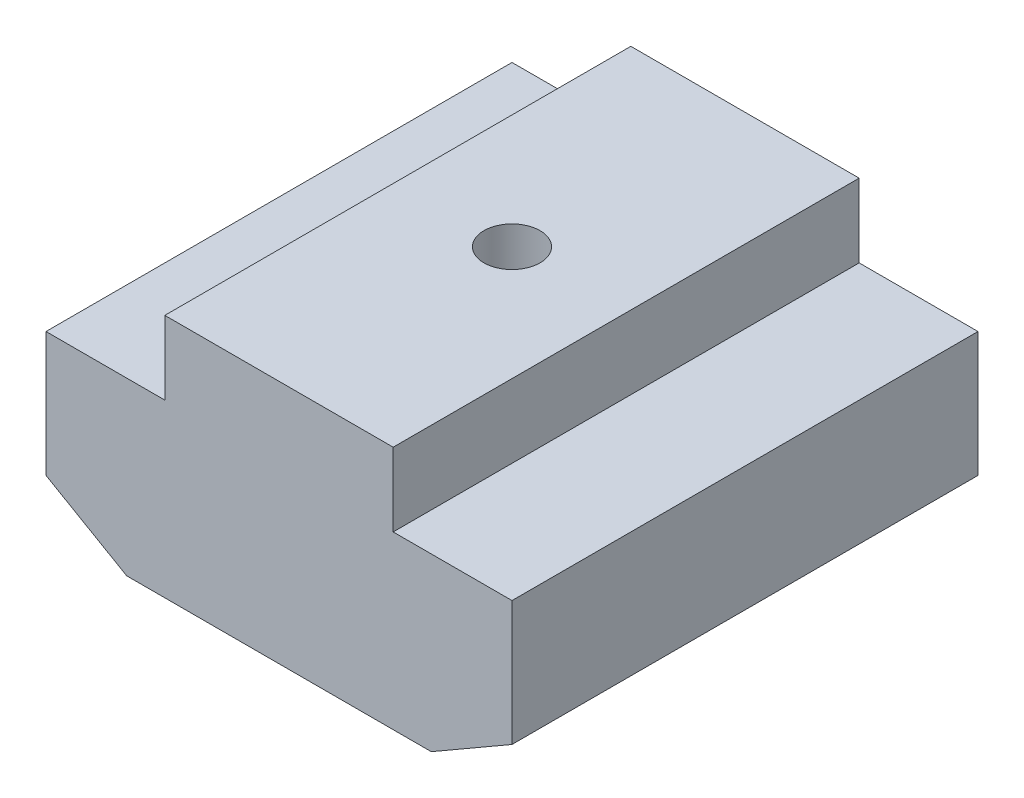
ISO-10303-21;
HEADER;
FILE_DESCRIPTION(('STEP AP214'),'2;1');
FILE_NAME('part.step','',(''),(''),'','','');
FILE_SCHEMA(('AUTOMOTIVE_DESIGN { 1 0 10303 214 1 1 1 1 }'));
ENDSEC;
DATA;
#1=APPLICATION_CONTEXT('core data for automotive mechanical design processes');
#2=APPLICATION_PROTOCOL_DEFINITION('international standard','automotive_design',2000,#1);
#3=PRODUCT_CONTEXT('',#1,'mechanical');
#4=PRODUCT('Part','Part','',(#3));
#5=PRODUCT_RELATED_PRODUCT_CATEGORY('part','',(#4));
#6=PRODUCT_DEFINITION_FORMATION('','',#4);
#7=PRODUCT_DEFINITION_CONTEXT('part definition',#1,'design');
#8=PRODUCT_DEFINITION('design','',#6,#7);
#9=PRODUCT_DEFINITION_SHAPE('','',#8);
#10=(LENGTH_UNIT() NAMED_UNIT(*) SI_UNIT(.MILLI.,.METRE.));
#11=(NAMED_UNIT(*) PLANE_ANGLE_UNIT() SI_UNIT($,.RADIAN.));
#12=(NAMED_UNIT(*) SI_UNIT($,.STERADIAN.) SOLID_ANGLE_UNIT());
#13=UNCERTAINTY_MEASURE_WITH_UNIT(LENGTH_MEASURE(1.E-05),#10,'distance_accuracy_value','');
#14=(GEOMETRIC_REPRESENTATION_CONTEXT(3) GLOBAL_UNCERTAINTY_ASSIGNED_CONTEXT((#13)) GLOBAL_UNIT_ASSIGNED_CONTEXT((#10,
#11,#12)) REPRESENTATION_CONTEXT('',''));
#15=CARTESIAN_POINT('',(0.,0.,0.));
#16=DIRECTION('',(0.,0.,1.));
#17=DIRECTION('',(1.,0.,0.));
#18=AXIS2_PLACEMENT_3D('',#15,#16,#17);
#19=CARTESIAN_POINT('',(-10.,-1.675,0.));
#20=DIRECTION('',(0.50000000000019,0.866025403784329,0.));
#21=DIRECTION('',(0.,0.,-1.));
#22=AXIS2_PLACEMENT_3D('',#19,#20,#21);
#23=PLANE('',#22);
#24=DIRECTION('',(0.,0.,1.));
#25=VECTOR('',#24,1.);
#26=CARTESIAN_POINT('',(-10.,-1.675,0.));
#27=LINE('',#26,#25);
#28=CARTESIAN_POINT('',(-10.,-1.675,-10.));
#29=VERTEX_POINT('',#28);
#30=CARTESIAN_POINT('',(-10.,-1.675,10.));
#31=VERTEX_POINT('',#30);
#32=EDGE_CURVE('E274',#29,#31,#27,.T.);
#33=ORIENTED_EDGE('',*,*,#32,.F.);
#34=DIRECTION('',(0.866025403784329,-0.50000000000019,0.));
#35=VECTOR('',#34,1.);
#36=CARTESIAN_POINT('',(-8.26794919243,-2.675,-10.));
#37=LINE('',#36,#35);
#38=CARTESIAN_POINT('',(-6.53589838486,-3.675,-10.));
#39=VERTEX_POINT('',#38);
#40=EDGE_CURVE('E185',#29,#39,#37,.T.);
#41=ORIENTED_EDGE('',*,*,#40,.T.);
#42=DIRECTION('',(0.,0.,1.));
#43=VECTOR('',#42,1.);
#44=CARTESIAN_POINT('',(-6.53589838486,-3.675,0.));
#45=LINE('',#44,#43);
#46=CARTESIAN_POINT('',(-6.53589838486,-3.675,10.));
#47=VERTEX_POINT('',#46);
#48=EDGE_CURVE('E11',#39,#47,#45,.T.);
#49=ORIENTED_EDGE('',*,*,#48,.T.);
#50=DIRECTION('',(-0.866025403784329,0.50000000000019,0.));
#51=VECTOR('',#50,1.);
#52=CARTESIAN_POINT('',(-8.26794919243,-2.675,10.));
#53=LINE('',#52,#51);
#54=EDGE_CURVE('E25',#47,#31,#53,.T.);
#55=ORIENTED_EDGE('',*,*,#54,.T.);
#56=EDGE_LOOP('',(#33,#41,#49,#55));
#57=FACE_BOUND('',#56,.T.);
#58=ADVANCED_FACE('F17',(#57),#23,.F.);
#59=CARTESIAN_POINT('',(10.,-3.675,0.));
#60=DIRECTION('',(0.,1.,0.));
#61=DIRECTION('',(1.,0.,0.));
#62=AXIS2_PLACEMENT_3D('',#59,#60,#61);
#63=PLANE('',#62);
#64=CARTESIAN_POINT('',(0.,-3.675,0.));
#65=DIRECTION('',(0.,1.,0.));
#66=DIRECTION('',(1.,0.,0.));
#67=AXIS2_PLACEMENT_3D('',#64,#65,#66);
#68=CIRCLE('',#67,2.067);
#69=CARTESIAN_POINT('',(-2.067,-3.675,0.));
#70=VERTEX_POINT('',#69);
#71=CARTESIAN_POINT('',(2.067,-3.675,0.));
#72=VERTEX_POINT('',#71);
#73=EDGE_CURVE('E144',#70,#72,#68,.T.);
#74=ORIENTED_EDGE('',*,*,#73,.T.);
#75=CARTESIAN_POINT('',(0.,-3.675,0.));
#76=DIRECTION('',(0.,1.,0.));
#77=DIRECTION('',(1.,0.,0.));
#78=AXIS2_PLACEMENT_3D('',#75,#76,#77);
#79=CIRCLE('',#78,2.067);
#80=EDGE_CURVE('E140',#72,#70,#79,.T.);
#81=ORIENTED_EDGE('',*,*,#80,.T.);
#82=EDGE_LOOP('',(#74,#81));
#83=FACE_BOUND('',#82,.T.);
#84=ORIENTED_EDGE('',*,*,#48,.F.);
#85=DIRECTION('',(1.,0.,0.));
#86=VECTOR('',#85,1.);
#87=CARTESIAN_POINT('',(0.,-3.675,-10.));
#88=LINE('',#87,#86);
#89=CARTESIAN_POINT('',(6.53589838486,-3.675,-10.));
#90=VERTEX_POINT('',#89);
#91=EDGE_CURVE('E187',#39,#90,#88,.T.);
#92=ORIENTED_EDGE('',*,*,#91,.T.);
#93=DIRECTION('',(0.,0.,1.));
#94=VECTOR('',#93,1.);
#95=CARTESIAN_POINT('',(6.53589838486,-3.675,0.));
#96=LINE('',#95,#94);
#97=CARTESIAN_POINT('',(6.53589838486,-3.675,10.));
#98=VERTEX_POINT('',#97);
#99=EDGE_CURVE('E265',#90,#98,#96,.T.);
#100=ORIENTED_EDGE('',*,*,#99,.T.);
#101=DIRECTION('',(1.,0.,0.));
#102=VECTOR('',#101,1.);
#103=CARTESIAN_POINT('',(0.,-3.675,10.));
#104=LINE('',#103,#102);
#105=EDGE_CURVE('E259',#47,#98,#104,.T.);
#106=ORIENTED_EDGE('',*,*,#105,.F.);
#107=EDGE_LOOP('',(#84,#92,#100,#106));
#108=FACE_BOUND('',#107,.T.);
#109=ADVANCED_FACE('F142',(#83,#108),#63,.F.);
#110=CARTESIAN_POINT('',(0.,0.,10.));
#111=DIRECTION('',(0.,0.,1.));
#112=DIRECTION('',(1.,0.,0.));
#113=AXIS2_PLACEMENT_3D('',#110,#111,#112);
#114=PLANE('',#113);
#115=ORIENTED_EDGE('',*,*,#105,.T.);
#116=DIRECTION('',(-0.866025403784329,-0.50000000000019,0.));
#117=VECTOR('',#116,1.);
#118=CARTESIAN_POINT('',(8.26794919243,-2.675,10.));
#119=LINE('',#118,#117);
#120=CARTESIAN_POINT('',(10.,-1.675,10.));
#121=VERTEX_POINT('',#120);
#122=EDGE_CURVE('E277',#121,#98,#119,.T.);
#123=ORIENTED_EDGE('',*,*,#122,.F.);
#124=DIRECTION('',(0.,1.,0.));
#125=VECTOR('',#124,1.);
#126=CARTESIAN_POINT('',(10.,1.,10.));
#127=LINE('',#126,#125);
#128=CARTESIAN_POINT('',(10.,3.675,10.));
#129=VERTEX_POINT('',#128);
#130=EDGE_CURVE('E262',#121,#129,#127,.T.);
#131=ORIENTED_EDGE('',*,*,#130,.T.);
#132=DIRECTION('',(-1.,0.,0.));
#133=VECTOR('',#132,1.);
#134=CARTESIAN_POINT('',(7.45,3.675,10.));
#135=LINE('',#134,#133);
#136=CARTESIAN_POINT('',(4.9,3.675,10.));
#137=VERTEX_POINT('',#136);
#138=EDGE_CURVE('E215',#129,#137,#135,.T.);
#139=ORIENTED_EDGE('',*,*,#138,.T.);
#140=DIRECTION('',(0.,1.,0.));
#141=VECTOR('',#140,1.);
#142=CARTESIAN_POINT('',(4.9,5.25,10.));
#143=LINE('',#142,#141);
#144=CARTESIAN_POINT('',(4.9,6.825,10.));
#145=VERTEX_POINT('',#144);
#146=EDGE_CURVE('E251',#137,#145,#143,.T.);
#147=ORIENTED_EDGE('',*,*,#146,.T.);
#148=DIRECTION('',(-1.,0.,0.));
#149=VECTOR('',#148,1.);
#150=CARTESIAN_POINT('',(0.,6.825,10.));
#151=LINE('',#150,#149);
#152=CARTESIAN_POINT('',(-4.9,6.825,10.));
#153=VERTEX_POINT('',#152);
#154=EDGE_CURVE('E196',#145,#153,#151,.T.);
#155=ORIENTED_EDGE('',*,*,#154,.T.);
#156=DIRECTION('',(0.,-1.,0.));
#157=VECTOR('',#156,1.);
#158=CARTESIAN_POINT('',(-4.9,5.25,10.));
#159=LINE('',#158,#157);
#160=CARTESIAN_POINT('',(-4.9,3.675,10.));
#161=VERTEX_POINT('',#160);
#162=EDGE_CURVE('E240',#153,#161,#159,.T.);
#163=ORIENTED_EDGE('',*,*,#162,.T.);
#164=DIRECTION('',(-1.,0.,0.));
#165=VECTOR('',#164,1.);
#166=CARTESIAN_POINT('',(-7.45,3.675,10.));
#167=LINE('',#166,#165);
#168=CARTESIAN_POINT('',(-10.,3.675,10.));
#169=VERTEX_POINT('',#168);
#170=EDGE_CURVE('E229',#161,#169,#167,.T.);
#171=ORIENTED_EDGE('',*,*,#170,.T.);
#172=DIRECTION('',(0.,-1.,0.));
#173=VECTOR('',#172,1.);
#174=CARTESIAN_POINT('',(-10.,1.,10.));
#175=LINE('',#174,#173);
#176=EDGE_CURVE('E270',#169,#31,#175,.T.);
#177=ORIENTED_EDGE('',*,*,#176,.T.);
#178=ORIENTED_EDGE('',*,*,#54,.F.);
#179=EDGE_LOOP('',(#115,#123,#131,#139,#147,#155,#163,#171,#177,#178));
#180=FACE_BOUND('',#179,.T.);
#181=ADVANCED_FACE('F291',(#180),#114,.T.);
#182=CARTESIAN_POINT('',(0.,0.,-10.));
#183=DIRECTION('',(0.,0.,1.));
#184=DIRECTION('',(1.,0.,0.));
#185=AXIS2_PLACEMENT_3D('',#182,#183,#184);
#186=PLANE('',#185);
#187=ORIENTED_EDGE('',*,*,#40,.F.);
#188=DIRECTION('',(0.,-1.,0.));
#189=VECTOR('',#188,1.);
#190=CARTESIAN_POINT('',(-10.,1.,-10.));
#191=LINE('',#190,#189);
#192=CARTESIAN_POINT('',(-10.,3.675,-10.));
#193=VERTEX_POINT('',#192);
#194=EDGE_CURVE('E188',#193,#29,#191,.T.);
#195=ORIENTED_EDGE('',*,*,#194,.F.);
#196=DIRECTION('',(-1.,0.,0.));
#197=VECTOR('',#196,1.);
#198=CARTESIAN_POINT('',(-7.45,3.675,-10.));
#199=LINE('',#198,#197);
#200=CARTESIAN_POINT('',(-4.9,3.675,-10.));
#201=VERTEX_POINT('',#200);
#202=EDGE_CURVE('E170',#201,#193,#199,.T.);
#203=ORIENTED_EDGE('',*,*,#202,.F.);
#204=DIRECTION('',(0.,-1.,0.));
#205=VECTOR('',#204,1.);
#206=CARTESIAN_POINT('',(-4.9,5.25,-10.));
#207=LINE('',#206,#205);
#208=CARTESIAN_POINT('',(-4.9,6.825,-10.));
#209=VERTEX_POINT('',#208);
#210=EDGE_CURVE('E237',#209,#201,#207,.T.);
#211=ORIENTED_EDGE('',*,*,#210,.F.);
#212=DIRECTION('',(-1.,0.,0.));
#213=VECTOR('',#212,1.);
#214=CARTESIAN_POINT('',(0.,6.825,-10.));
#215=LINE('',#214,#213);
#216=CARTESIAN_POINT('',(4.9,6.825,-10.));
#217=VERTEX_POINT('',#216);
#218=EDGE_CURVE('E200',#217,#209,#215,.T.);
#219=ORIENTED_EDGE('',*,*,#218,.F.);
#220=DIRECTION('',(0.,1.,0.));
#221=VECTOR('',#220,1.);
#222=CARTESIAN_POINT('',(4.9,5.25,-10.));
#223=LINE('',#222,#221);
#224=CARTESIAN_POINT('',(4.9,3.675,-10.));
#225=VERTEX_POINT('',#224);
#226=EDGE_CURVE('E243',#225,#217,#223,.T.);
#227=ORIENTED_EDGE('',*,*,#226,.F.);
#228=DIRECTION('',(-1.,0.,0.));
#229=VECTOR('',#228,1.);
#230=CARTESIAN_POINT('',(7.45,3.675,-10.));
#231=LINE('',#230,#229);
#232=CARTESIAN_POINT('',(10.,3.675,-10.));
#233=VERTEX_POINT('',#232);
#234=EDGE_CURVE('E207',#233,#225,#231,.T.);
#235=ORIENTED_EDGE('',*,*,#234,.F.);
#236=DIRECTION('',(0.,1.,0.));
#237=VECTOR('',#236,1.);
#238=CARTESIAN_POINT('',(10.,1.,-10.));
#239=LINE('',#238,#237);
#240=CARTESIAN_POINT('',(10.,-1.675,-10.));
#241=VERTEX_POINT('',#240);
#242=EDGE_CURVE('E225',#241,#233,#239,.T.);
#243=ORIENTED_EDGE('',*,*,#242,.F.);
#244=DIRECTION('',(0.866025403784329,0.50000000000019,0.));
#245=VECTOR('',#244,1.);
#246=CARTESIAN_POINT('',(8.26794919243,-2.675,-10.));
#247=LINE('',#246,#245);
#248=EDGE_CURVE('E269',#90,#241,#247,.T.);
#249=ORIENTED_EDGE('',*,*,#248,.F.);
#250=ORIENTED_EDGE('',*,*,#91,.F.);
#251=EDGE_LOOP('',(#187,#195,#203,#211,#219,#227,#235,#243,#249,#250));
#252=FACE_BOUND('',#251,.T.);
#253=ADVANCED_FACE('F300',(#252),#186,.F.);
#254=CARTESIAN_POINT('',(-10.,-3.675,0.));
#255=DIRECTION('',(1.,0.,0.));
#256=DIRECTION('',(0.,1.,0.));
#257=AXIS2_PLACEMENT_3D('',#254,#255,#256);
#258=PLANE('',#257);
#259=ORIENTED_EDGE('',*,*,#32,.T.);
#260=ORIENTED_EDGE('',*,*,#176,.F.);
#261=DIRECTION('',(0.,0.,1.));
#262=VECTOR('',#261,1.);
#263=CARTESIAN_POINT('',(-10.,3.675,0.));
#264=LINE('',#263,#262);
#265=EDGE_CURVE('E173',#193,#169,#264,.T.);
#266=ORIENTED_EDGE('',*,*,#265,.F.);
#267=ORIENTED_EDGE('',*,*,#194,.T.);
#268=EDGE_LOOP('',(#259,#260,#266,#267));
#269=FACE_BOUND('',#268,.T.);
#270=ADVANCED_FACE('F327',(#269),#258,.F.);
#271=CARTESIAN_POINT('',(10.,-1.675,0.));
#272=DIRECTION('',(-0.50000000000019,0.866025403784329,0.));
#273=DIRECTION('',(0.,0.,1.));
#274=AXIS2_PLACEMENT_3D('',#271,#272,#273);
#275=PLANE('',#274);
#276=ORIENTED_EDGE('',*,*,#99,.F.);
#277=ORIENTED_EDGE('',*,*,#248,.T.);
#278=DIRECTION('',(0.,0.,1.));
#279=VECTOR('',#278,1.);
#280=CARTESIAN_POINT('',(10.,-1.675,0.));
#281=LINE('',#280,#279);
#282=EDGE_CURVE('E199',#241,#121,#281,.T.);
#283=ORIENTED_EDGE('',*,*,#282,.T.);
#284=ORIENTED_EDGE('',*,*,#122,.T.);
#285=EDGE_LOOP('',(#276,#277,#283,#284));
#286=FACE_BOUND('',#285,.T.);
#287=ADVANCED_FACE('F295',(#286),#275,.F.);
#288=CARTESIAN_POINT('',(10.,3.675,0.));
#289=DIRECTION('',(-1.,0.,0.));
#290=DIRECTION('',(0.,0.,1.));
#291=AXIS2_PLACEMENT_3D('',#288,#289,#290);
#292=PLANE('',#291);
#293=ORIENTED_EDGE('',*,*,#282,.F.);
#294=ORIENTED_EDGE('',*,*,#242,.T.);
#295=DIRECTION('',(0.,0.,1.));
#296=VECTOR('',#295,1.);
#297=CARTESIAN_POINT('',(10.,3.675,0.));
#298=LINE('',#297,#296);
#299=EDGE_CURVE('E203',#233,#129,#298,.T.);
#300=ORIENTED_EDGE('',*,*,#299,.T.);
#301=ORIENTED_EDGE('',*,*,#130,.F.);
#302=EDGE_LOOP('',(#293,#294,#300,#301));
#303=FACE_BOUND('',#302,.T.);
#304=ADVANCED_FACE('F304',(#303),#292,.F.);
#305=CARTESIAN_POINT('',(-4.9,6.825,0.));
#306=DIRECTION('',(0.,-1.,0.));
#307=DIRECTION('',(0.,0.,-1.));
#308=AXIS2_PLACEMENT_3D('',#305,#306,#307);
#309=PLANE('',#308);
#310=CARTESIAN_POINT('',(0.,6.825,0.));
#311=DIRECTION('',(0.,-1.,0.));
#312=DIRECTION('',(1.,0.,0.));
#313=AXIS2_PLACEMENT_3D('',#310,#311,#312);
#314=CIRCLE('',#313,1.20097459622);
#315=CARTESIAN_POINT('',(1.20097459622,6.825,0.));
#316=VERTEX_POINT('',#315);
#317=CARTESIAN_POINT('',(-1.20097459622,6.825,0.));
#318=VERTEX_POINT('',#317);
#319=EDGE_CURVE('E178',#316,#318,#314,.T.);
#320=ORIENTED_EDGE('',*,*,#319,.T.);
#321=CARTESIAN_POINT('',(0.,6.825,0.));
#322=DIRECTION('',(0.,-1.,0.));
#323=DIRECTION('',(1.,0.,0.));
#324=AXIS2_PLACEMENT_3D('',#321,#322,#323);
#325=CIRCLE('',#324,1.20097459622);
#326=EDGE_CURVE('E195',#318,#316,#325,.T.);
#327=ORIENTED_EDGE('',*,*,#326,.T.);
#328=EDGE_LOOP('',(#320,#327));
#329=FACE_BOUND('',#328,.T.);
#330=DIRECTION('',(0.,0.,1.));
#331=VECTOR('',#330,1.);
#332=CARTESIAN_POINT('',(4.9,6.825,0.));
#333=LINE('',#332,#331);
#334=EDGE_CURVE('E247',#217,#145,#333,.T.);
#335=ORIENTED_EDGE('',*,*,#334,.F.);
#336=ORIENTED_EDGE('',*,*,#218,.T.);
#337=DIRECTION('',(0.,0.,1.));
#338=VECTOR('',#337,1.);
#339=CARTESIAN_POINT('',(-4.9,6.825,0.));
#340=LINE('',#339,#338);
#341=EDGE_CURVE('E233',#209,#153,#340,.T.);
#342=ORIENTED_EDGE('',*,*,#341,.T.);
#343=ORIENTED_EDGE('',*,*,#154,.F.);
#344=EDGE_LOOP('',(#335,#336,#342,#343));
#345=FACE_BOUND('',#344,.T.);
#346=ADVANCED_FACE('F319',(#329,#345),#309,.F.);
#347=CARTESIAN_POINT('',(4.9,6.825,0.));
#348=DIRECTION('',(-1.,0.,0.));
#349=DIRECTION('',(0.,0.,1.));
#350=AXIS2_PLACEMENT_3D('',#347,#348,#349);
#351=PLANE('',#350);
#352=DIRECTION('',(0.,0.,1.));
#353=VECTOR('',#352,1.);
#354=CARTESIAN_POINT('',(4.9,3.675,0.));
#355=LINE('',#354,#353);
#356=EDGE_CURVE('E211',#225,#137,#355,.T.);
#357=ORIENTED_EDGE('',*,*,#356,.F.);
#358=ORIENTED_EDGE('',*,*,#226,.T.);
#359=ORIENTED_EDGE('',*,*,#334,.T.);
#360=ORIENTED_EDGE('',*,*,#146,.F.);
#361=EDGE_LOOP('',(#357,#358,#359,#360));
#362=FACE_BOUND('',#361,.T.);
#363=ADVANCED_FACE('F310',(#362),#351,.F.);
#364=CARTESIAN_POINT('',(-4.9,3.675,0.));
#365=DIRECTION('',(1.,0.,0.));
#366=DIRECTION('',(0.,1.,0.));
#367=AXIS2_PLACEMENT_3D('',#364,#365,#366);
#368=PLANE('',#367);
#369=ORIENTED_EDGE('',*,*,#341,.F.);
#370=ORIENTED_EDGE('',*,*,#210,.T.);
#371=DIRECTION('',(0.,0.,1.));
#372=VECTOR('',#371,1.);
#373=CARTESIAN_POINT('',(-4.9,3.675,0.));
#374=LINE('',#373,#372);
#375=EDGE_CURVE('E174',#201,#161,#374,.T.);
#376=ORIENTED_EDGE('',*,*,#375,.T.);
#377=ORIENTED_EDGE('',*,*,#162,.F.);
#378=EDGE_LOOP('',(#369,#370,#376,#377));
#379=FACE_BOUND('',#378,.T.);
#380=ADVANCED_FACE('F317',(#379),#368,.F.);
#381=CARTESIAN_POINT('',(4.9,3.675,0.));
#382=DIRECTION('',(0.,-1.,0.));
#383=DIRECTION('',(0.,0.,-1.));
#384=AXIS2_PLACEMENT_3D('',#381,#382,#383);
#385=PLANE('',#384);
#386=ORIENTED_EDGE('',*,*,#375,.F.);
#387=ORIENTED_EDGE('',*,*,#202,.T.);
#388=ORIENTED_EDGE('',*,*,#265,.T.);
#389=ORIENTED_EDGE('',*,*,#170,.F.);
#390=EDGE_LOOP('',(#386,#387,#388,#389));
#391=FACE_BOUND('',#390,.T.);
#392=ADVANCED_FACE('F324',(#391),#385,.F.);
#393=CARTESIAN_POINT('',(4.9,3.675,0.));
#394=DIRECTION('',(0.,-1.,0.));
#395=DIRECTION('',(0.,0.,-1.));
#396=AXIS2_PLACEMENT_3D('',#393,#394,#395);
#397=PLANE('',#396);
#398=ORIENTED_EDGE('',*,*,#299,.F.);
#399=ORIENTED_EDGE('',*,*,#234,.T.);
#400=ORIENTED_EDGE('',*,*,#356,.T.);
#401=ORIENTED_EDGE('',*,*,#138,.F.);
#402=EDGE_LOOP('',(#398,#399,#400,#401));
#403=FACE_BOUND('',#402,.T.);
#404=ADVANCED_FACE('F307',(#403),#397,.F.);
#405=CARTESIAN_POINT('',(0.,6.51838300641,0.));
#406=DIRECTION('',(0.,-1.,0.));
#407=DIRECTION('',(1.,0.,0.));
#408=AXIS2_PLACEMENT_3D('',#405,#406,#407);
#409=CONICAL_SURFACE('',#408,1.73205080758248,1.0471975512);
#410=ORIENTED_EDGE('',*,*,#326,.F.);
#411=DIRECTION('',(-0.866025403784329,-0.50000000000019,0.));
#412=VECTOR('',#411,1.);
#413=CARTESIAN_POINT('',(-1.0335,6.92169150321,0.));
#414=LINE('',#413,#412);
#415=CARTESIAN_POINT('',(-2.067,6.325,0.));
#416=VERTEX_POINT('',#415);
#417=EDGE_CURVE('E192',#318,#416,#414,.T.);
#418=ORIENTED_EDGE('',*,*,#417,.T.);
#419=CARTESIAN_POINT('',(0.,6.325,0.));
#420=DIRECTION('',(0.,1.,0.));
#421=DIRECTION('',(1.,0.,0.));
#422=AXIS2_PLACEMENT_3D('',#419,#420,#421);
#423=CIRCLE('',#422,2.067);
#424=CARTESIAN_POINT('',(2.067,6.325,0.));
#425=VERTEX_POINT('',#424);
#426=EDGE_CURVE('E149',#425,#416,#423,.T.);
#427=ORIENTED_EDGE('',*,*,#426,.F.);
#428=DIRECTION('',(0.866025403784329,-0.50000000000019,0.));
#429=VECTOR('',#428,1.);
#430=CARTESIAN_POINT('',(1.0335,6.92169150321,0.));
#431=LINE('',#430,#429);
#432=EDGE_CURVE('E182',#316,#425,#431,.T.);
#433=ORIENTED_EDGE('',*,*,#432,.F.);
#434=EDGE_LOOP('',(#410,#418,#427,#433));
#435=FACE_BOUND('',#434,.T.);
#436=ADVANCED_FACE('F407',(#435),#409,.F.);
#437=CARTESIAN_POINT('',(0.,6.51838300641,0.));
#438=DIRECTION('',(0.,-1.,0.));
#439=DIRECTION('',(1.,0.,0.));
#440=AXIS2_PLACEMENT_3D('',#437,#438,#439);
#441=CONICAL_SURFACE('',#440,1.73205080758248,1.0471975512);
#442=ORIENTED_EDGE('',*,*,#319,.F.);
#443=ORIENTED_EDGE('',*,*,#432,.T.);
#444=CARTESIAN_POINT('',(0.,6.325,0.));
#445=DIRECTION('',(0.,1.,0.));
#446=DIRECTION('',(1.,0.,0.));
#447=AXIS2_PLACEMENT_3D('',#444,#445,#446);
#448=CIRCLE('',#447,2.067);
#449=EDGE_CURVE('E161',#416,#425,#448,.T.);
#450=ORIENTED_EDGE('',*,*,#449,.F.);
#451=ORIENTED_EDGE('',*,*,#417,.F.);
#452=EDGE_LOOP('',(#442,#443,#450,#451));
#453=FACE_BOUND('',#452,.T.);
#454=ADVANCED_FACE('F415',(#453),#441,.F.);
#455=CARTESIAN_POINT('',(0.,-3.675,0.));
#456=DIRECTION('',(0.,1.,0.));
#457=DIRECTION('',(1.,0.,0.));
#458=AXIS2_PLACEMENT_3D('',#455,#456,#457);
#459=CYLINDRICAL_SURFACE('',#458,2.067);
#460=ORIENTED_EDGE('',*,*,#80,.F.);
#461=DIRECTION('',(0.,-1.,0.));
#462=VECTOR('',#461,1.);
#463=CARTESIAN_POINT('',(2.067,1.16999999996,0.));
#464=LINE('',#463,#462);
#465=EDGE_CURVE('E150',#425,#72,#464,.T.);
#466=ORIENTED_EDGE('',*,*,#465,.F.);
#467=ORIENTED_EDGE('',*,*,#426,.T.);
#468=DIRECTION('',(0.,-1.,0.));
#469=VECTOR('',#468,1.);
#470=CARTESIAN_POINT('',(-2.067,1.16999999996,0.));
#471=LINE('',#470,#469);
#472=EDGE_CURVE('E154',#416,#70,#471,.T.);
#473=ORIENTED_EDGE('',*,*,#472,.T.);
#474=EDGE_LOOP('',(#460,#466,#467,#473));
#475=FACE_BOUND('',#474,.T.);
#476=ADVANCED_FACE('F155',(#475),#459,.F.);
#477=CARTESIAN_POINT('',(0.,-3.675,0.));
#478=DIRECTION('',(0.,1.,0.));
#479=DIRECTION('',(1.,0.,0.));
#480=AXIS2_PLACEMENT_3D('',#477,#478,#479);
#481=CYLINDRICAL_SURFACE('',#480,2.067);
#482=ORIENTED_EDGE('',*,*,#73,.F.);
#483=ORIENTED_EDGE('',*,*,#472,.F.);
#484=ORIENTED_EDGE('',*,*,#449,.T.);
#485=ORIENTED_EDGE('',*,*,#465,.T.);
#486=EDGE_LOOP('',(#482,#483,#484,#485));
#487=FACE_BOUND('',#486,.T.);
#488=ADVANCED_FACE('F163',(#487),#481,.F.);
#489=CLOSED_SHELL('',(#58,#109,#181,#253,#270,#287,#304,#346,#363,#380,#392,#404,#436,#454,#476,#488));
#490=MANIFOLD_SOLID_BREP('B1',#489);
#491=ADVANCED_BREP_SHAPE_REPRESENTATION('',(#18,#490),#14);
#492=SHAPE_DEFINITION_REPRESENTATION(#9,#491);
ENDSEC;
END-ISO-10303-21;
